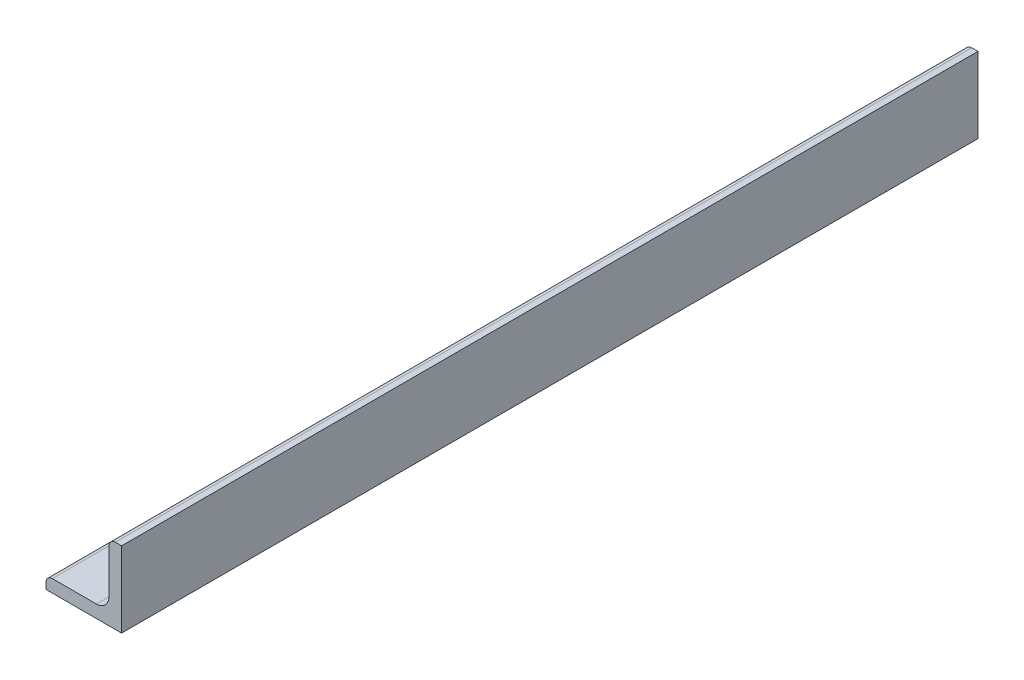
ISO-10303-21;
HEADER;
FILE_DESCRIPTION(('STEP AP214'),'2;1');
FILE_NAME('part.step','',(''),(''),'','','');
FILE_SCHEMA(('AUTOMOTIVE_DESIGN { 1 0 10303 214 1 1 1 1 }'));
ENDSEC;
DATA;
#1=APPLICATION_CONTEXT('core data for automotive mechanical design processes');
#2=APPLICATION_PROTOCOL_DEFINITION('international standard','automotive_design',2000,#1);
#3=PRODUCT_CONTEXT('',#1,'mechanical');
#4=PRODUCT('Part','Part','',(#3));
#5=PRODUCT_RELATED_PRODUCT_CATEGORY('part','',(#4));
#6=PRODUCT_DEFINITION_FORMATION('','',#4);
#7=PRODUCT_DEFINITION_CONTEXT('part definition',#1,'design');
#8=PRODUCT_DEFINITION('design','',#6,#7);
#9=PRODUCT_DEFINITION_SHAPE('','',#8);
#10=(LENGTH_UNIT() NAMED_UNIT(*) SI_UNIT(.MILLI.,.METRE.));
#11=(NAMED_UNIT(*) PLANE_ANGLE_UNIT() SI_UNIT($,.RADIAN.));
#12=(NAMED_UNIT(*) SI_UNIT($,.STERADIAN.) SOLID_ANGLE_UNIT());
#13=UNCERTAINTY_MEASURE_WITH_UNIT(LENGTH_MEASURE(1.E-05),#10,'distance_accuracy_value','');
#14=(GEOMETRIC_REPRESENTATION_CONTEXT(3) GLOBAL_UNCERTAINTY_ASSIGNED_CONTEXT((#13)) GLOBAL_UNIT_ASSIGNED_CONTEXT((#10,
#11,#12)) REPRESENTATION_CONTEXT('',''));
#15=CARTESIAN_POINT('',(0.,0.,0.));
#16=DIRECTION('',(0.,0.,1.));
#17=DIRECTION('',(1.,0.,0.));
#18=AXIS2_PLACEMENT_3D('',#15,#16,#17);
#19=CARTESIAN_POINT('',(-9.52500000000062,1.58749999999999,107.95));
#20=DIRECTION('',(1.,0.,0.));
#21=DIRECTION('',(0.,0.,-1.));
#22=AXIS2_PLACEMENT_3D('',#19,#20,#21);
#23=PLANE('',#22);
#24=DIRECTION('',(0.,-1.,0.));
#25=VECTOR('',#24,1.);
#26=CARTESIAN_POINT('',(-9.52500000000062,1.58749999999999,-107.95));
#27=LINE('',#26,#25);
#28=CARTESIAN_POINT('',(-9.52500000000062,1.58749999999999,-107.95));
#29=VERTEX_POINT('',#28);
#30=CARTESIAN_POINT('',(-9.52500000000001,0.,-107.95));
#31=VERTEX_POINT('',#30);
#32=EDGE_CURVE('E136',#29,#31,#27,.T.);
#33=ORIENTED_EDGE('',*,*,#32,.T.);
#34=DIRECTION('',(0.,0.,-1.));
#35=VECTOR('',#34,1.);
#36=CARTESIAN_POINT('',(-9.52500000000039,0.,107.95));
#37=LINE('',#36,#35);
#38=CARTESIAN_POINT('',(-9.52500000000039,0.,107.95));
#39=VERTEX_POINT('',#38);
#40=EDGE_CURVE('E11',#39,#31,#37,.T.);
#41=ORIENTED_EDGE('',*,*,#40,.F.);
#42=DIRECTION('',(0.,-1.,0.));
#43=VECTOR('',#42,1.);
#44=CARTESIAN_POINT('',(-9.52500000000062,1.58749999999999,107.95));
#45=LINE('',#44,#43);
#46=CARTESIAN_POINT('',(-9.52500000000062,1.58749999999999,107.95));
#47=VERTEX_POINT('',#46);
#48=EDGE_CURVE('E153',#47,#39,#45,.T.);
#49=ORIENTED_EDGE('',*,*,#48,.F.);
#50=DIRECTION('',(0.,0.,-1.));
#51=VECTOR('',#50,1.);
#52=CARTESIAN_POINT('',(-9.52500000000062,1.58749999999999,107.95));
#53=LINE('',#52,#51);
#54=EDGE_CURVE('E132',#47,#29,#53,.T.);
#55=ORIENTED_EDGE('',*,*,#54,.T.);
#56=EDGE_LOOP('',(#33,#41,#49,#55));
#57=FACE_BOUND('',#56,.T.);
#58=ADVANCED_FACE('F34',(#57),#23,.F.);
#59=CARTESIAN_POINT('',(-9.52500000000039,0.,107.95));
#60=DIRECTION('',(0.,1.,0.));
#61=DIRECTION('',(0.,0.,1.));
#62=AXIS2_PLACEMENT_3D('',#59,#60,#61);
#63=PLANE('',#62);
#64=CARTESIAN_POINT('',(-0.293738300000068,0.,95.2500000000003));
#65=DIRECTION('',(0.,1.,0.));
#66=DIRECTION('',(0.,0.,1.));
#67=AXIS2_PLACEMENT_3D('',#64,#65,#66);
#68=CIRCLE('',#67,1.35255);
#69=CARTESIAN_POINT('',(-0.293738300000068,0.,96.6025500000003));
#70=VERTEX_POINT('',#69);
#71=EDGE_CURVE('E199',#70,#70,#68,.T.);
#72=ORIENTED_EDGE('',*,*,#71,.T.);
#73=EDGE_LOOP('',(#72));
#74=FACE_BOUND('',#73,.T.);
#75=CARTESIAN_POINT('',(-0.293738300000124,0.,-95.2499999999998));
#76=DIRECTION('',(0.,1.,0.));
#77=DIRECTION('',(0.,0.,1.));
#78=AXIS2_PLACEMENT_3D('',#75,#76,#77);
#79=CIRCLE('',#78,1.35255);
#80=CARTESIAN_POINT('',(-0.293738300000124,0.,-93.8974499999998));
#81=VERTEX_POINT('',#80);
#82=EDGE_CURVE('E140',#81,#81,#79,.T.);
#83=ORIENTED_EDGE('',*,*,#82,.T.);
#84=EDGE_LOOP('',(#83));
#85=FACE_BOUND('',#84,.T.);
#86=DIRECTION('',(1.,0.,0.));
#87=VECTOR('',#86,1.);
#88=CARTESIAN_POINT('',(-9.52500000000001,0.,-107.95));
#89=LINE('',#88,#87);
#90=CARTESIAN_POINT('',(9.52500000000001,-3.05311331771918E-13,-107.95));
#91=VERTEX_POINT('',#90);
#92=EDGE_CURVE('E139',#31,#91,#89,.T.);
#93=ORIENTED_EDGE('',*,*,#92,.T.);
#94=DIRECTION('',(0.,0.,-1.));
#95=VECTOR('',#94,1.);
#96=CARTESIAN_POINT('',(9.52499999999962,-3.05311331771918E-13,107.95));
#97=LINE('',#96,#95);
#98=CARTESIAN_POINT('',(9.52499999999962,-3.05311331771918E-13,107.95));
#99=VERTEX_POINT('',#98);
#100=EDGE_CURVE('E42',#99,#91,#97,.T.);
#101=ORIENTED_EDGE('',*,*,#100,.F.);
#102=DIRECTION('',(1.,0.,0.));
#103=VECTOR('',#102,1.);
#104=CARTESIAN_POINT('',(-9.52500000000039,0.,107.95));
#105=LINE('',#104,#103);
#106=EDGE_CURVE('E96',#39,#99,#105,.T.);
#107=ORIENTED_EDGE('',*,*,#106,.F.);
#108=ORIENTED_EDGE('',*,*,#40,.T.);
#109=EDGE_LOOP('',(#93,#101,#107,#108));
#110=FACE_BOUND('',#109,.T.);
#111=ADVANCED_FACE('F228',(#74,#85,#110),#63,.F.);
#112=CARTESIAN_POINT('',(9.52499999999962,-3.05311331771918E-13,107.95));
#113=DIRECTION('',(-1.,0.,0.));
#114=DIRECTION('',(0.,0.,1.));
#115=AXIS2_PLACEMENT_3D('',#112,#113,#114);
#116=PLANE('',#115);
#117=DIRECTION('',(0.,1.,0.));
#118=VECTOR('',#117,1.);
#119=CARTESIAN_POINT('',(9.52500000000001,-3.05311331771918E-13,-107.95));
#120=LINE('',#119,#118);
#121=CARTESIAN_POINT('',(9.52500000000001,19.0499999999997,-107.95));
#122=VERTEX_POINT('',#121);
#123=EDGE_CURVE('E142',#91,#122,#120,.T.);
#124=ORIENTED_EDGE('',*,*,#123,.T.);
#125=DIRECTION('',(0.,0.,-1.));
#126=VECTOR('',#125,1.);
#127=CARTESIAN_POINT('',(9.52499999999939,19.05,107.95));
#128=LINE('',#127,#126);
#129=CARTESIAN_POINT('',(9.52499999999939,19.05,107.95));
#130=VERTEX_POINT('',#129);
#131=EDGE_CURVE('E163',#130,#122,#128,.T.);
#132=ORIENTED_EDGE('',*,*,#131,.F.);
#133=DIRECTION('',(0.,1.,0.));
#134=VECTOR('',#133,1.);
#135=CARTESIAN_POINT('',(9.52499999999962,-3.05311331771918E-13,107.95));
#136=LINE('',#135,#134);
#137=EDGE_CURVE('E171',#99,#130,#136,.T.);
#138=ORIENTED_EDGE('',*,*,#137,.F.);
#139=ORIENTED_EDGE('',*,*,#100,.T.);
#140=EDGE_LOOP('',(#124,#132,#138,#139));
#141=FACE_BOUND('',#140,.T.);
#142=ADVANCED_FACE('F169',(#141),#116,.F.);
#143=CARTESIAN_POINT('',(7.93749999999943,19.05,107.95));
#144=DIRECTION('',(0.,-1.,0.));
#145=DIRECTION('',(0.,0.,-1.));
#146=AXIS2_PLACEMENT_3D('',#143,#144,#145);
#147=PLANE('',#146);
#148=DIRECTION('',(-1.,0.,0.));
#149=VECTOR('',#148,1.);
#150=CARTESIAN_POINT('',(7.93749999999999,19.05,-107.95));
#151=LINE('',#150,#149);
#152=CARTESIAN_POINT('',(7.93749999999999,19.05,-107.95));
#153=VERTEX_POINT('',#152);
#154=EDGE_CURVE('E144',#122,#153,#151,.T.);
#155=ORIENTED_EDGE('',*,*,#154,.T.);
#156=DIRECTION('',(0.,0.,-1.));
#157=VECTOR('',#156,1.);
#158=CARTESIAN_POINT('',(7.93749999999943,19.05,107.95));
#159=LINE('',#158,#157);
#160=CARTESIAN_POINT('',(7.93749999999943,19.05,107.95));
#161=VERTEX_POINT('',#160);
#162=EDGE_CURVE('E160',#161,#153,#159,.T.);
#163=ORIENTED_EDGE('',*,*,#162,.F.);
#164=DIRECTION('',(-1.,0.,0.));
#165=VECTOR('',#164,1.);
#166=CARTESIAN_POINT('',(7.93749999999943,19.05,107.95));
#167=LINE('',#166,#165);
#168=EDGE_CURVE('E187',#130,#161,#167,.T.);
#169=ORIENTED_EDGE('',*,*,#168,.F.);
#170=ORIENTED_EDGE('',*,*,#131,.T.);
#171=EDGE_LOOP('',(#155,#163,#169,#170));
#172=FACE_BOUND('',#171,.T.);
#173=ADVANCED_FACE('F180',(#172),#147,.F.);
#174=CARTESIAN_POINT('',(7.93749999999943,17.4625,107.95));
#175=DIRECTION('',(0.,0.,-1.));
#176=DIRECTION('',(-1.,0.,0.));
#177=AXIS2_PLACEMENT_3D('',#174,#175,#176);
#178=CYLINDRICAL_SURFACE('',#177,1.5875);
#179=CARTESIAN_POINT('',(7.93749999999999,17.4624999999999,-107.95));
#180=DIRECTION('',(0.,0.,1.));
#181=DIRECTION('',(-1.,0.,0.));
#182=AXIS2_PLACEMENT_3D('',#179,#180,#181);
#183=CIRCLE('',#182,1.5875);
#184=CARTESIAN_POINT('',(6.34999999999997,17.4625,-107.95));
#185=VERTEX_POINT('',#184);
#186=EDGE_CURVE('E146',#153,#185,#183,.T.);
#187=ORIENTED_EDGE('',*,*,#186,.T.);
#188=DIRECTION('',(0.,0.,-1.));
#189=VECTOR('',#188,1.);
#190=CARTESIAN_POINT('',(6.34999999999941,17.4625000000003,107.95));
#191=LINE('',#190,#189);
#192=CARTESIAN_POINT('',(6.34999999999941,17.4625000000003,107.95));
#193=VERTEX_POINT('',#192);
#194=EDGE_CURVE('E157',#193,#185,#191,.T.);
#195=ORIENTED_EDGE('',*,*,#194,.F.);
#196=CARTESIAN_POINT('',(7.93749999999943,17.4625,107.95));
#197=DIRECTION('',(0.,0.,1.));
#198=DIRECTION('',(-1.,0.,0.));
#199=AXIS2_PLACEMENT_3D('',#196,#197,#198);
#200=CIRCLE('',#199,1.5875);
#201=EDGE_CURVE('E186',#161,#193,#200,.T.);
#202=ORIENTED_EDGE('',*,*,#201,.F.);
#203=ORIENTED_EDGE('',*,*,#162,.T.);
#204=EDGE_LOOP('',(#187,#195,#202,#203));
#205=FACE_BOUND('',#204,.T.);
#206=ADVANCED_FACE('F184',(#205),#178,.T.);
#207=CARTESIAN_POINT('',(6.34999999999941,17.4625000000003,107.95));
#208=DIRECTION('',(1.,0.,0.));
#209=DIRECTION('',(0.,1.,0.));
#210=AXIS2_PLACEMENT_3D('',#207,#208,#209);
#211=PLANE('',#210);
#212=DIRECTION('',(0.,-1.,0.));
#213=VECTOR('',#212,1.);
#214=CARTESIAN_POINT('',(6.34999999999997,17.4625,-107.95));
#215=LINE('',#214,#213);
#216=CARTESIAN_POINT('',(6.34999999999941,6.34999999999999,-107.95));
#217=VERTEX_POINT('',#216);
#218=EDGE_CURVE('E148',#185,#217,#215,.T.);
#219=ORIENTED_EDGE('',*,*,#218,.T.);
#220=DIRECTION('',(0.,0.,-1.));
#221=VECTOR('',#220,1.);
#222=CARTESIAN_POINT('',(6.34999999999941,6.3500000000003,107.95));
#223=LINE('',#222,#221);
#224=CARTESIAN_POINT('',(6.34999999999941,6.3500000000003,107.95));
#225=VERTEX_POINT('',#224);
#226=EDGE_CURVE('E127',#225,#217,#223,.T.);
#227=ORIENTED_EDGE('',*,*,#226,.F.);
#228=DIRECTION('',(0.,-1.,0.));
#229=VECTOR('',#228,1.);
#230=CARTESIAN_POINT('',(6.34999999999941,17.4625000000003,107.95));
#231=LINE('',#230,#229);
#232=EDGE_CURVE('E118',#193,#225,#231,.T.);
#233=ORIENTED_EDGE('',*,*,#232,.F.);
#234=ORIENTED_EDGE('',*,*,#194,.T.);
#235=EDGE_LOOP('',(#219,#227,#233,#234));
#236=FACE_BOUND('',#235,.T.);
#237=ADVANCED_FACE('F237',(#236),#211,.F.);
#238=CARTESIAN_POINT('',(3.17499999999937,6.34999999999999,107.95));
#239=DIRECTION('',(0.,0.,-1.));
#240=DIRECTION('',(-1.,0.,0.));
#241=AXIS2_PLACEMENT_3D('',#238,#239,#240);
#242=CYLINDRICAL_SURFACE('',#241,3.175);
#243=CARTESIAN_POINT('',(3.17499999999943,6.34999999999999,-107.95));
#244=DIRECTION('',(0.,0.,-1.));
#245=DIRECTION('',(-1.,0.,0.));
#246=AXIS2_PLACEMENT_3D('',#243,#244,#245);
#247=CIRCLE('',#246,3.175);
#248=CARTESIAN_POINT('',(3.17499999999943,3.17499999999998,-107.95));
#249=VERTEX_POINT('',#248);
#250=EDGE_CURVE('E126',#217,#249,#247,.T.);
#251=ORIENTED_EDGE('',*,*,#250,.T.);
#252=DIRECTION('',(0.,0.,-1.));
#253=VECTOR('',#252,1.);
#254=CARTESIAN_POINT('',(3.17499999999937,3.17499999999998,107.95));
#255=LINE('',#254,#253);
#256=CARTESIAN_POINT('',(3.17499999999937,3.17499999999998,107.95));
#257=VERTEX_POINT('',#256);
#258=EDGE_CURVE('E123',#257,#249,#255,.T.);
#259=ORIENTED_EDGE('',*,*,#258,.F.);
#260=CARTESIAN_POINT('',(3.17499999999937,6.34999999999999,107.95));
#261=DIRECTION('',(0.,0.,-1.));
#262=DIRECTION('',(-1.,0.,0.));
#263=AXIS2_PLACEMENT_3D('',#260,#261,#262);
#264=CIRCLE('',#263,3.175);
#265=EDGE_CURVE('E112',#225,#257,#264,.T.);
#266=ORIENTED_EDGE('',*,*,#265,.F.);
#267=ORIENTED_EDGE('',*,*,#226,.T.);
#268=EDGE_LOOP('',(#251,#259,#266,#267));
#269=FACE_BOUND('',#268,.T.);
#270=ADVANCED_FACE('F124',(#269),#242,.F.);
#271=CARTESIAN_POINT('',(3.17499999999937,3.17499999999998,107.95));
#272=DIRECTION('',(0.,-1.,0.));
#273=DIRECTION('',(1.,0.,0.));
#274=AXIS2_PLACEMENT_3D('',#271,#272,#273);
#275=PLANE('',#274);
#276=CARTESIAN_POINT('',(-0.293738300000679,3.17500000000001,95.2500000000003));
#277=DIRECTION('',(0.,1.,0.));
#278=DIRECTION('',(0.,0.,1.));
#279=AXIS2_PLACEMENT_3D('',#276,#277,#278);
#280=CIRCLE('',#279,1.35254999999999);
#281=CARTESIAN_POINT('',(-0.293738300000679,3.17500000000001,96.6025500000003));
#282=VERTEX_POINT('',#281);
#283=EDGE_CURVE('E202',#282,#282,#280,.T.);
#284=ORIENTED_EDGE('',*,*,#283,.F.);
#285=EDGE_LOOP('',(#284));
#286=FACE_BOUND('',#285,.T.);
#287=CARTESIAN_POINT('',(-0.293738300000679,3.17500000000001,-95.2499999999998));
#288=DIRECTION('',(0.,1.,0.));
#289=DIRECTION('',(0.,0.,1.));
#290=AXIS2_PLACEMENT_3D('',#287,#288,#289);
#291=CIRCLE('',#290,1.35254999999999);
#292=CARTESIAN_POINT('',(-0.293738300000679,3.17500000000001,-93.8974499999998));
#293=VERTEX_POINT('',#292);
#294=EDGE_CURVE('E196',#293,#293,#291,.T.);
#295=ORIENTED_EDGE('',*,*,#294,.F.);
#296=EDGE_LOOP('',(#295));
#297=FACE_BOUND('',#296,.T.);
#298=DIRECTION('',(-1.,0.,0.));
#299=VECTOR('',#298,1.);
#300=CARTESIAN_POINT('',(3.17499999999943,3.17499999999998,-107.95));
#301=LINE('',#300,#299);
#302=CARTESIAN_POINT('',(-7.9375000000006,3.17499999999998,-107.95));
#303=VERTEX_POINT('',#302);
#304=EDGE_CURVE('E82',#249,#303,#301,.T.);
#305=ORIENTED_EDGE('',*,*,#304,.T.);
#306=DIRECTION('',(0.,0.,-1.));
#307=VECTOR('',#306,1.);
#308=CARTESIAN_POINT('',(-7.9375000000006,3.17500000000029,107.95));
#309=LINE('',#308,#307);
#310=CARTESIAN_POINT('',(-7.9375000000006,3.17500000000029,107.95));
#311=VERTEX_POINT('',#310);
#312=EDGE_CURVE('E128',#311,#303,#309,.T.);
#313=ORIENTED_EDGE('',*,*,#312,.F.);
#314=DIRECTION('',(-1.,0.,0.));
#315=VECTOR('',#314,1.);
#316=CARTESIAN_POINT('',(3.17499999999937,3.17499999999998,107.95));
#317=LINE('',#316,#315);
#318=EDGE_CURVE('E116',#257,#311,#317,.T.);
#319=ORIENTED_EDGE('',*,*,#318,.F.);
#320=ORIENTED_EDGE('',*,*,#258,.T.);
#321=EDGE_LOOP('',(#305,#313,#319,#320));
#322=FACE_BOUND('',#321,.T.);
#323=ADVANCED_FACE('F130',(#286,#297,#322),#275,.F.);
#324=CARTESIAN_POINT('',(-7.9375000000006,1.5875000000003,107.95));
#325=DIRECTION('',(0.,0.,-1.));
#326=DIRECTION('',(-1.,0.,0.));
#327=AXIS2_PLACEMENT_3D('',#324,#325,#326);
#328=CYLINDRICAL_SURFACE('',#327,1.5875);
#329=CARTESIAN_POINT('',(-7.9375000000006,1.58749999999999,-107.95));
#330=DIRECTION('',(0.,0.,1.));
#331=DIRECTION('',(-1.,0.,0.));
#332=AXIS2_PLACEMENT_3D('',#329,#330,#331);
#333=CIRCLE('',#332,1.5875);
#334=EDGE_CURVE('E88',#303,#29,#333,.T.);
#335=ORIENTED_EDGE('',*,*,#334,.T.);
#336=ORIENTED_EDGE('',*,*,#54,.F.);
#337=CARTESIAN_POINT('',(-7.9375000000006,1.5875000000003,107.95));
#338=DIRECTION('',(0.,0.,1.));
#339=DIRECTION('',(-1.,0.,0.));
#340=AXIS2_PLACEMENT_3D('',#337,#338,#339);
#341=CIRCLE('',#340,1.5875);
#342=EDGE_CURVE('E50',#311,#47,#341,.T.);
#343=ORIENTED_EDGE('',*,*,#342,.F.);
#344=ORIENTED_EDGE('',*,*,#312,.T.);
#345=EDGE_LOOP('',(#335,#336,#343,#344));
#346=FACE_BOUND('',#345,.T.);
#347=ADVANCED_FACE('F210',(#346),#328,.T.);
#348=CARTESIAN_POINT('',(7.93749999999943,17.4625,107.95));
#349=DIRECTION('',(0.,0.,-1.));
#350=DIRECTION('',(-1.,0.,0.));
#351=AXIS2_PLACEMENT_3D('',#348,#349,#350);
#352=PLANE('',#351);
#353=ORIENTED_EDGE('',*,*,#48,.T.);
#354=ORIENTED_EDGE('',*,*,#106,.T.);
#355=ORIENTED_EDGE('',*,*,#137,.T.);
#356=ORIENTED_EDGE('',*,*,#168,.T.);
#357=ORIENTED_EDGE('',*,*,#201,.T.);
#358=ORIENTED_EDGE('',*,*,#232,.T.);
#359=ORIENTED_EDGE('',*,*,#265,.T.);
#360=ORIENTED_EDGE('',*,*,#318,.T.);
#361=ORIENTED_EDGE('',*,*,#342,.T.);
#362=EDGE_LOOP('',(#353,#354,#355,#356,#357,#358,#359,#360,#361));
#363=FACE_BOUND('',#362,.T.);
#364=ADVANCED_FACE('F114',(#363),#352,.F.);
#365=CARTESIAN_POINT('',(7.93749999999999,17.4624999999999,-107.95));
#366=DIRECTION('',(0.,0.,-1.));
#367=DIRECTION('',(-1.,0.,0.));
#368=AXIS2_PLACEMENT_3D('',#365,#366,#367);
#369=PLANE('',#368);
#370=ORIENTED_EDGE('',*,*,#32,.F.);
#371=ORIENTED_EDGE('',*,*,#334,.F.);
#372=ORIENTED_EDGE('',*,*,#304,.F.);
#373=ORIENTED_EDGE('',*,*,#250,.F.);
#374=ORIENTED_EDGE('',*,*,#218,.F.);
#375=ORIENTED_EDGE('',*,*,#186,.F.);
#376=ORIENTED_EDGE('',*,*,#154,.F.);
#377=ORIENTED_EDGE('',*,*,#123,.F.);
#378=ORIENTED_EDGE('',*,*,#92,.F.);
#379=EDGE_LOOP('',(#370,#371,#372,#373,#374,#375,#376,#377,#378));
#380=FACE_BOUND('',#379,.T.);
#381=ADVANCED_FACE('F175',(#380),#369,.T.);
#382=CARTESIAN_POINT('',(-0.293738300000679,3.17500000000001,-95.2499999999998));
#383=DIRECTION('',(0.,1.,0.));
#384=DIRECTION('',(0.,0.,1.));
#385=AXIS2_PLACEMENT_3D('',#382,#383,#384);
#386=CYLINDRICAL_SURFACE('',#385,1.35254999999999);
#387=ORIENTED_EDGE('',*,*,#82,.F.);
#388=EDGE_LOOP('',(#387));
#389=FACE_BOUND('',#388,.T.);
#390=ORIENTED_EDGE('',*,*,#294,.T.);
#391=EDGE_LOOP('',(#390));
#392=FACE_BOUND('',#391,.T.);
#393=ADVANCED_FACE('F214',(#389,#392),#386,.F.);
#394=CARTESIAN_POINT('',(-0.293738300000679,3.17500000000001,95.2500000000003));
#395=DIRECTION('',(0.,1.,0.));
#396=DIRECTION('',(0.,0.,1.));
#397=AXIS2_PLACEMENT_3D('',#394,#395,#396);
#398=CYLINDRICAL_SURFACE('',#397,1.35254999999999);
#399=ORIENTED_EDGE('',*,*,#71,.F.);
#400=EDGE_LOOP('',(#399));
#401=FACE_BOUND('',#400,.T.);
#402=ORIENTED_EDGE('',*,*,#283,.T.);
#403=EDGE_LOOP('',(#402));
#404=FACE_BOUND('',#403,.T.);
#405=ADVANCED_FACE('F206',(#401,#404),#398,.F.);
#406=CLOSED_SHELL('',(#58,#111,#142,#173,#206,#237,#270,#323,#347,#364,#381,#393,#405));
#407=MANIFOLD_SOLID_BREP('B2',#406);
#408=ADVANCED_BREP_SHAPE_REPRESENTATION('',(#18,#407),#14);
#409=SHAPE_DEFINITION_REPRESENTATION(#9,#408);
ENDSEC;
END-ISO-10303-21;
